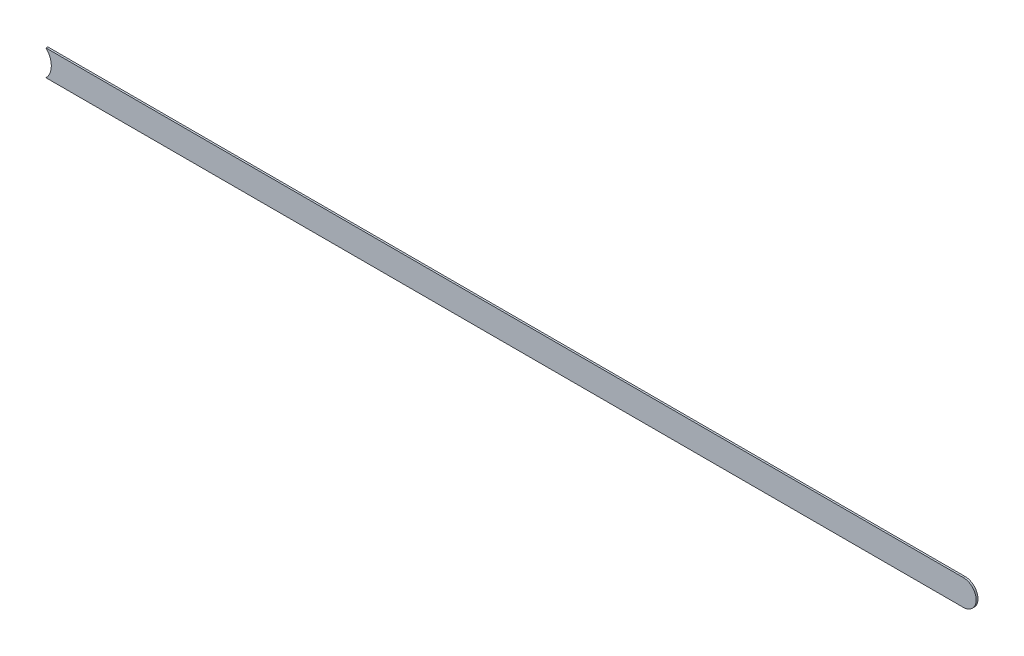
ISO-10303-21;
HEADER;
FILE_DESCRIPTION(('STEP AP214'),'2;1');
FILE_NAME('part.step','',(''),(''),'','','');
FILE_SCHEMA(('AUTOMOTIVE_DESIGN { 1 0 10303 214 1 1 1 1 }'));
ENDSEC;
DATA;
#1=APPLICATION_CONTEXT('core data for automotive mechanical design processes');
#2=APPLICATION_PROTOCOL_DEFINITION('international standard','automotive_design',2000,#1);
#3=PRODUCT_CONTEXT('',#1,'mechanical');
#4=PRODUCT('Part','Part','',(#3));
#5=PRODUCT_RELATED_PRODUCT_CATEGORY('part','',(#4));
#6=PRODUCT_DEFINITION_FORMATION('','',#4);
#7=PRODUCT_DEFINITION_CONTEXT('part definition',#1,'design');
#8=PRODUCT_DEFINITION('design','',#6,#7);
#9=PRODUCT_DEFINITION_SHAPE('','',#8);
#10=(LENGTH_UNIT() NAMED_UNIT(*) SI_UNIT(.MILLI.,.METRE.));
#11=(NAMED_UNIT(*) PLANE_ANGLE_UNIT() SI_UNIT($,.RADIAN.));
#12=(NAMED_UNIT(*) SI_UNIT($,.STERADIAN.) SOLID_ANGLE_UNIT());
#13=UNCERTAINTY_MEASURE_WITH_UNIT(LENGTH_MEASURE(1.E-05),#10,'distance_accuracy_value','');
#14=(GEOMETRIC_REPRESENTATION_CONTEXT(3) GLOBAL_UNCERTAINTY_ASSIGNED_CONTEXT((#13)) GLOBAL_UNIT_ASSIGNED_CONTEXT((#10,
#11,#12)) REPRESENTATION_CONTEXT('',''));
#15=CARTESIAN_POINT('',(0.,0.,0.));
#16=DIRECTION('',(0.,0.,1.));
#17=DIRECTION('',(1.,0.,0.));
#18=AXIS2_PLACEMENT_3D('',#15,#16,#17);
#19=CARTESIAN_POINT('',(50.6528873555931,67.75000166,0.));
#20=DIRECTION('',(0.,1.,0.));
#21=DIRECTION('',(1.,0.,0.));
#22=AXIS2_PLACEMENT_3D('',#19,#20,#21);
#23=PLANE('',#22);
#24=DIRECTION('',(1.,0.,0.));
#25=VECTOR('',#24,1.);
#26=CARTESIAN_POINT('',(50.4000008,67.75000166,0.03556));
#27=LINE('',#26,#25);
#28=CARTESIAN_POINT('',(50.6528873555931,67.75000166,0.03556));
#29=VERTEX_POINT('',#28);
#30=CARTESIAN_POINT('',(68.40000036,67.75000166,0.03556));
#31=VERTEX_POINT('',#30);
#32=EDGE_CURVE('E11',#29,#31,#27,.T.);
#33=ORIENTED_EDGE('',*,*,#32,.F.);
#34=DIRECTION('',(0.,0.,1.));
#35=VECTOR('',#34,1.);
#36=CARTESIAN_POINT('',(50.6528873555931,67.75000166,0.));
#37=LINE('',#36,#35);
#38=CARTESIAN_POINT('',(50.6528873555931,67.75000166,0.));
#39=VERTEX_POINT('',#38);
#40=EDGE_CURVE('E24',#39,#29,#37,.T.);
#41=ORIENTED_EDGE('',*,*,#40,.F.);
#42=DIRECTION('',(1.,0.,0.));
#43=VECTOR('',#42,1.);
#44=CARTESIAN_POINT('',(50.4000008,67.75000166,0.));
#45=LINE('',#44,#43);
#46=CARTESIAN_POINT('',(68.40000036,67.75000166,0.));
#47=VERTEX_POINT('',#46);
#48=EDGE_CURVE('E82',#39,#47,#45,.T.);
#49=ORIENTED_EDGE('',*,*,#48,.T.);
#50=DIRECTION('',(0.,0.,1.));
#51=VECTOR('',#50,1.);
#52=CARTESIAN_POINT('',(68.40000036,67.75000166,0.));
#53=LINE('',#52,#51);
#54=EDGE_CURVE('E37',#47,#31,#53,.T.);
#55=ORIENTED_EDGE('',*,*,#54,.T.);
#56=EDGE_LOOP('',(#33,#41,#49,#55));
#57=FACE_BOUND('',#56,.T.);
#58=ADVANCED_FACE('F17',(#57),#23,.F.);
#59=CARTESIAN_POINT('',(68.40000036,68.00000116,0.));
#60=DIRECTION('',(0.,0.,-1.));
#61=DIRECTION('',(0.,-1.,0.));
#62=AXIS2_PLACEMENT_3D('',#59,#60,#61);
#63=CYLINDRICAL_SURFACE('',#62,0.249999500000001);
#64=CARTESIAN_POINT('',(68.40000036,68.00000116,0.03556));
#65=DIRECTION('',(0.,0.,1.));
#66=DIRECTION('',(0.,-1.,0.));
#67=AXIS2_PLACEMENT_3D('',#64,#65,#66);
#68=CIRCLE('',#67,0.249999500000001);
#69=CARTESIAN_POINT('',(68.40000036,68.25000066,0.03556));
#70=VERTEX_POINT('',#69);
#71=EDGE_CURVE('E97',#31,#70,#68,.T.);
#72=ORIENTED_EDGE('',*,*,#71,.F.);
#73=ORIENTED_EDGE('',*,*,#54,.F.);
#74=CARTESIAN_POINT('',(68.40000036,68.00000116,0.));
#75=DIRECTION('',(0.,0.,1.));
#76=DIRECTION('',(0.,-1.,0.));
#77=AXIS2_PLACEMENT_3D('',#74,#75,#76);
#78=CIRCLE('',#77,0.249999500000001);
#79=CARTESIAN_POINT('',(68.40000036,68.25000066,0.));
#80=VERTEX_POINT('',#79);
#81=EDGE_CURVE('E94',#47,#80,#78,.T.);
#82=ORIENTED_EDGE('',*,*,#81,.T.);
#83=DIRECTION('',(0.,0.,1.));
#84=VECTOR('',#83,1.);
#85=CARTESIAN_POINT('',(68.40000036,68.25000066,0.));
#86=LINE('',#85,#84);
#87=EDGE_CURVE('E92',#80,#70,#86,.T.);
#88=ORIENTED_EDGE('',*,*,#87,.T.);
#89=EDGE_LOOP('',(#72,#73,#82,#88));
#90=FACE_BOUND('',#89,.T.);
#91=ADVANCED_FACE('F103',(#90),#63,.T.);
#92=CARTESIAN_POINT('',(68.40000036,68.25000066,0.));
#93=DIRECTION('',(0.,-1.,0.));
#94=DIRECTION('',(-1.,0.,0.));
#95=AXIS2_PLACEMENT_3D('',#92,#93,#94);
#96=PLANE('',#95);
#97=DIRECTION('',(-1.,0.,0.));
#98=VECTOR('',#97,1.);
#99=CARTESIAN_POINT('',(68.40000036,68.25000066,0.03556));
#100=LINE('',#99,#98);
#101=CARTESIAN_POINT('',(50.6528873555931,68.25000066,0.03556));
#102=VERTEX_POINT('',#101);
#103=EDGE_CURVE('E89',#70,#102,#100,.T.);
#104=ORIENTED_EDGE('',*,*,#103,.F.);
#105=ORIENTED_EDGE('',*,*,#87,.F.);
#106=DIRECTION('',(-1.,0.,0.));
#107=VECTOR('',#106,1.);
#108=CARTESIAN_POINT('',(68.40000036,68.25000066,0.));
#109=LINE('',#108,#107);
#110=CARTESIAN_POINT('',(50.6528873555931,68.25000066,0.));
#111=VERTEX_POINT('',#110);
#112=EDGE_CURVE('E87',#80,#111,#109,.T.);
#113=ORIENTED_EDGE('',*,*,#112,.T.);
#114=DIRECTION('',(0.,0.,1.));
#115=VECTOR('',#114,1.);
#116=CARTESIAN_POINT('',(50.6528873555931,68.25000066,0.));
#117=LINE('',#116,#115);
#118=EDGE_CURVE('E69',#111,#102,#117,.T.);
#119=ORIENTED_EDGE('',*,*,#118,.T.);
#120=EDGE_LOOP('',(#104,#105,#113,#119));
#121=FACE_BOUND('',#120,.T.);
#122=ADVANCED_FACE('F108',(#121),#96,.F.);
#123=CARTESIAN_POINT('',(50.4000008,68.00000116,0.));
#124=DIRECTION('',(0.,0.,-1.));
#125=DIRECTION('',(1.,0.,0.));
#126=AXIS2_PLACEMENT_3D('',#123,#124,#125);
#127=CYLINDRICAL_SURFACE('',#126,0.3556);
#128=DIRECTION('',(0.,0.,1.));
#129=VECTOR('',#128,1.);
#130=CARTESIAN_POINT('',(50.7556008,68.00000116,0.));
#131=LINE('',#130,#129);
#132=CARTESIAN_POINT('',(50.7556008,68.00000116,0.));
#133=VERTEX_POINT('',#132);
#134=CARTESIAN_POINT('',(50.7556008,68.00000116,0.03556));
#135=VERTEX_POINT('',#134);
#136=EDGE_CURVE('E59',#133,#135,#131,.T.);
#137=ORIENTED_EDGE('',*,*,#136,.T.);
#138=CARTESIAN_POINT('',(50.4000008,68.00000116,0.03556));
#139=DIRECTION('',(0.,0.,1.));
#140=DIRECTION('',(1.,0.,0.));
#141=AXIS2_PLACEMENT_3D('',#138,#139,#140);
#142=CIRCLE('',#141,0.3556);
#143=EDGE_CURVE('E70',#135,#102,#142,.T.);
#144=ORIENTED_EDGE('',*,*,#143,.T.);
#145=ORIENTED_EDGE('',*,*,#118,.F.);
#146=CARTESIAN_POINT('',(50.4000008,68.00000116,0.));
#147=DIRECTION('',(0.,0.,1.));
#148=DIRECTION('',(1.,0.,0.));
#149=AXIS2_PLACEMENT_3D('',#146,#147,#148);
#150=CIRCLE('',#149,0.3556);
#151=EDGE_CURVE('E73',#133,#111,#150,.T.);
#152=ORIENTED_EDGE('',*,*,#151,.F.);
#153=EDGE_LOOP('',(#137,#144,#145,#152));
#154=FACE_BOUND('',#153,.T.);
#155=ADVANCED_FACE('F74',(#154),#127,.F.);
#156=CARTESIAN_POINT('',(50.4000008,68.00000116,0.));
#157=DIRECTION('',(0.,0.,-1.));
#158=DIRECTION('',(1.,0.,0.));
#159=AXIS2_PLACEMENT_3D('',#156,#157,#158);
#160=CYLINDRICAL_SURFACE('',#159,0.3556);
#161=ORIENTED_EDGE('',*,*,#40,.T.);
#162=CARTESIAN_POINT('',(50.4000008,68.00000116,0.03556));
#163=DIRECTION('',(0.,0.,1.));
#164=DIRECTION('',(1.,0.,0.));
#165=AXIS2_PLACEMENT_3D('',#162,#163,#164);
#166=CIRCLE('',#165,0.3556);
#167=EDGE_CURVE('E65',#29,#135,#166,.T.);
#168=ORIENTED_EDGE('',*,*,#167,.T.);
#169=ORIENTED_EDGE('',*,*,#136,.F.);
#170=EDGE_CURVE('E63',#39,#133,#150,.T.);
#171=ORIENTED_EDGE('',*,*,#170,.F.);
#172=EDGE_LOOP('',(#161,#168,#169,#171));
#173=FACE_BOUND('',#172,.T.);
#174=ADVANCED_FACE('F61',(#173),#160,.F.);
#175=CARTESIAN_POINT('',(50.4000008,67.75000166,0.));
#176=DIRECTION('',(0.,0.,-1.));
#177=DIRECTION('',(-1.,0.,0.));
#178=AXIS2_PLACEMENT_3D('',#175,#176,#177);
#179=PLANE('',#178);
#180=ORIENTED_EDGE('',*,*,#48,.F.);
#181=ORIENTED_EDGE('',*,*,#170,.T.);
#182=ORIENTED_EDGE('',*,*,#151,.T.);
#183=ORIENTED_EDGE('',*,*,#112,.F.);
#184=ORIENTED_EDGE('',*,*,#81,.F.);
#185=EDGE_LOOP('',(#180,#181,#182,#183,#184));
#186=FACE_BOUND('',#185,.T.);
#187=ADVANCED_FACE('F80',(#186),#179,.T.);
#188=CARTESIAN_POINT('',(50.4000008,67.75000166,0.03556));
#189=DIRECTION('',(0.,0.,-1.));
#190=DIRECTION('',(-1.,0.,0.));
#191=AXIS2_PLACEMENT_3D('',#188,#189,#190);
#192=PLANE('',#191);
#193=ORIENTED_EDGE('',*,*,#167,.F.);
#194=ORIENTED_EDGE('',*,*,#32,.T.);
#195=ORIENTED_EDGE('',*,*,#71,.T.);
#196=ORIENTED_EDGE('',*,*,#103,.T.);
#197=ORIENTED_EDGE('',*,*,#143,.F.);
#198=EDGE_LOOP('',(#193,#194,#195,#196,#197));
#199=FACE_BOUND('',#198,.T.);
#200=ADVANCED_FACE('F106',(#199),#192,.F.);
#201=CLOSED_SHELL('',(#58,#91,#122,#155,#174,#187,#200));
#202=MANIFOLD_SOLID_BREP('B1',#201);
#203=ADVANCED_BREP_SHAPE_REPRESENTATION('',(#18,#202),#14);
#204=SHAPE_DEFINITION_REPRESENTATION(#9,#203);
ENDSEC;
END-ISO-10303-21;
